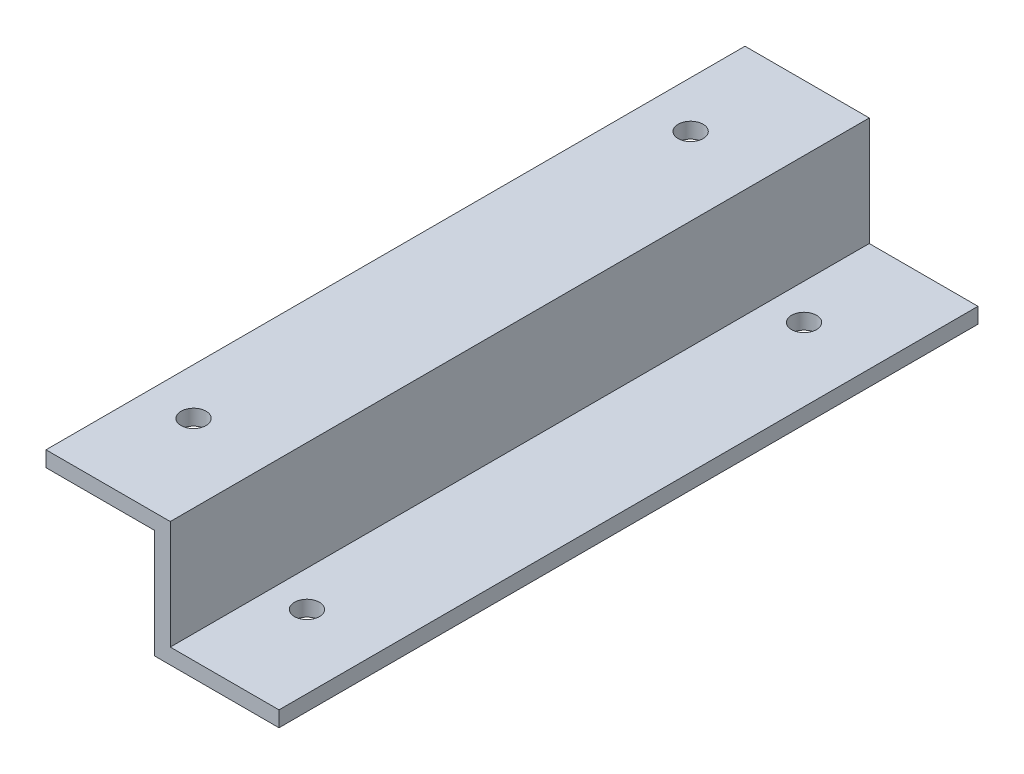
ISO-10303-21;
HEADER;
FILE_DESCRIPTION(('STEP AP214'),'2;1');
FILE_NAME('part.step','',(''),(''),'','','');
FILE_SCHEMA(('AUTOMOTIVE_DESIGN { 1 0 10303 214 1 1 1 1 }'));
ENDSEC;
DATA;
#1=APPLICATION_CONTEXT('core data for automotive mechanical design processes');
#2=APPLICATION_PROTOCOL_DEFINITION('international standard','automotive_design',2000,#1);
#3=PRODUCT_CONTEXT('',#1,'mechanical');
#4=PRODUCT('Part','Part','',(#3));
#5=PRODUCT_RELATED_PRODUCT_CATEGORY('part','',(#4));
#6=PRODUCT_DEFINITION_FORMATION('','',#4);
#7=PRODUCT_DEFINITION_CONTEXT('part definition',#1,'design');
#8=PRODUCT_DEFINITION('design','',#6,#7);
#9=PRODUCT_DEFINITION_SHAPE('','',#8);
#10=(LENGTH_UNIT() NAMED_UNIT(*) SI_UNIT(.MILLI.,.METRE.));
#11=(NAMED_UNIT(*) PLANE_ANGLE_UNIT() SI_UNIT($,.RADIAN.));
#12=(NAMED_UNIT(*) SI_UNIT($,.STERADIAN.) SOLID_ANGLE_UNIT());
#13=UNCERTAINTY_MEASURE_WITH_UNIT(LENGTH_MEASURE(1.E-05),#10,'distance_accuracy_value','');
#14=(GEOMETRIC_REPRESENTATION_CONTEXT(3) GLOBAL_UNCERTAINTY_ASSIGNED_CONTEXT((#13)) GLOBAL_UNIT_ASSIGNED_CONTEXT((#10,
#11,#12)) REPRESENTATION_CONTEXT('',''));
#15=CARTESIAN_POINT('',(0.,0.,0.));
#16=DIRECTION('',(0.,0.,1.));
#17=DIRECTION('',(1.,0.,0.));
#18=AXIS2_PLACEMENT_3D('',#15,#16,#17);
#19=CARTESIAN_POINT('',(1.5875,-9.525,71.4375));
#20=DIRECTION('',(0.,-1.,0.));
#21=DIRECTION('',(0.,0.,-1.));
#22=AXIS2_PLACEMENT_3D('',#19,#20,#21);
#23=PLANE('',#22);
#24=CARTESIAN_POINT('',(8.89000000000002,-9.525,50.799999492));
#25=DIRECTION('',(0.,1.,0.));
#26=DIRECTION('',(0.,0.,1.));
#27=AXIS2_PLACEMENT_3D('',#24,#25,#26);
#28=CIRCLE('',#27,2.55269999999999);
#29=CARTESIAN_POINT('',(8.89000000000002,-9.525,53.352699492));
#30=VERTEX_POINT('',#29);
#31=EDGE_CURVE('E213',#30,#30,#28,.T.);
#32=ORIENTED_EDGE('',*,*,#31,.F.);
#33=EDGE_LOOP('',(#32));
#34=FACE_BOUND('',#33,.T.);
#35=CARTESIAN_POINT('',(8.89000000000002,-9.525,-50.7997000062309));
#36=DIRECTION('',(0.,1.,0.));
#37=DIRECTION('',(0.,0.,1.));
#38=AXIS2_PLACEMENT_3D('',#35,#36,#37);
#39=CIRCLE('',#38,2.55269999999999);
#40=CARTESIAN_POINT('',(8.89000000000002,-9.525,-48.2470000062309));
#41=VERTEX_POINT('',#40);
#42=EDGE_CURVE('E216',#41,#41,#39,.T.);
#43=ORIENTED_EDGE('',*,*,#42,.F.);
#44=EDGE_LOOP('',(#43));
#45=FACE_BOUND('',#44,.T.);
#46=DIRECTION('',(0.,0.,-1.));
#47=VECTOR('',#46,1.);
#48=CARTESIAN_POINT('',(23.8125,-9.525,71.4375));
#49=LINE('',#48,#47);
#50=CARTESIAN_POINT('',(23.8125,-9.525,71.4375));
#51=VERTEX_POINT('',#50);
#52=CARTESIAN_POINT('',(23.8125,-9.525,-71.4375));
#53=VERTEX_POINT('',#52);
#54=EDGE_CURVE('E123',#51,#53,#49,.T.);
#55=ORIENTED_EDGE('',*,*,#54,.T.);
#56=DIRECTION('',(-1.,0.,0.));
#57=VECTOR('',#56,1.);
#58=CARTESIAN_POINT('',(1.5875,-9.525,-71.4375));
#59=LINE('',#58,#57);
#60=CARTESIAN_POINT('',(1.5875,-9.525,-71.4375));
#61=VERTEX_POINT('',#60);
#62=EDGE_CURVE('E117',#53,#61,#59,.T.);
#63=ORIENTED_EDGE('',*,*,#62,.T.);
#64=DIRECTION('',(0.,0.,-1.));
#65=VECTOR('',#64,1.);
#66=CARTESIAN_POINT('',(1.5875,-9.525,71.4375));
#67=LINE('',#66,#65);
#68=CARTESIAN_POINT('',(1.5875,-9.525,71.4375));
#69=VERTEX_POINT('',#68);
#70=EDGE_CURVE('E11',#69,#61,#67,.T.);
#71=ORIENTED_EDGE('',*,*,#70,.F.);
#72=DIRECTION('',(-1.,0.,0.));
#73=VECTOR('',#72,1.);
#74=CARTESIAN_POINT('',(1.5875,-9.525,71.4375));
#75=LINE('',#74,#73);
#76=EDGE_CURVE('E146',#51,#69,#75,.T.);
#77=ORIENTED_EDGE('',*,*,#76,.F.);
#78=EDGE_LOOP('',(#55,#63,#71,#77));
#79=FACE_BOUND('',#78,.T.);
#80=ADVANCED_FACE('F39',(#34,#45,#79),#23,.F.);
#81=CARTESIAN_POINT('',(1.5875,-9.525,71.4375));
#82=DIRECTION('',(-1.,0.,0.));
#83=DIRECTION('',(0.,0.,1.));
#84=AXIS2_PLACEMENT_3D('',#81,#82,#83);
#85=PLANE('',#84);
#86=ORIENTED_EDGE('',*,*,#70,.T.);
#87=DIRECTION('',(0.,1.,0.));
#88=VECTOR('',#87,1.);
#89=CARTESIAN_POINT('',(1.5875,-9.525,-71.4375));
#90=LINE('',#89,#88);
#91=CARTESIAN_POINT('',(1.5875,12.7,-71.4375));
#92=VERTEX_POINT('',#91);
#93=EDGE_CURVE('E107',#61,#92,#90,.T.);
#94=ORIENTED_EDGE('',*,*,#93,.T.);
#95=DIRECTION('',(0.,0.,-1.));
#96=VECTOR('',#95,1.);
#97=CARTESIAN_POINT('',(1.5875,12.7,71.4375));
#98=LINE('',#97,#96);
#99=CARTESIAN_POINT('',(1.5875,12.7,71.4375));
#100=VERTEX_POINT('',#99);
#101=EDGE_CURVE('E47',#100,#92,#98,.T.);
#102=ORIENTED_EDGE('',*,*,#101,.F.);
#103=DIRECTION('',(0.,1.,0.));
#104=VECTOR('',#103,1.);
#105=CARTESIAN_POINT('',(1.5875,-9.525,71.4375));
#106=LINE('',#105,#104);
#107=EDGE_CURVE('E108',#69,#100,#106,.T.);
#108=ORIENTED_EDGE('',*,*,#107,.F.);
#109=EDGE_LOOP('',(#86,#94,#102,#108));
#110=FACE_BOUND('',#109,.T.);
#111=ADVANCED_FACE('F105',(#110),#85,.F.);
#112=CARTESIAN_POINT('',(1.5875,12.7,71.4375));
#113=DIRECTION('',(0.,-1.,0.));
#114=DIRECTION('',(0.,0.,-1.));
#115=AXIS2_PLACEMENT_3D('',#112,#113,#114);
#116=PLANE('',#115);
#117=CARTESIAN_POINT('',(-14.2874999999999,12.7,50.799999492));
#118=DIRECTION('',(0.,1.,0.));
#119=DIRECTION('',(0.,0.,1.));
#120=AXIS2_PLACEMENT_3D('',#117,#118,#119);
#121=CIRCLE('',#120,2.55269999999999);
#122=CARTESIAN_POINT('',(-14.2874999999999,12.7,53.352699492));
#123=VERTEX_POINT('',#122);
#124=EDGE_CURVE('E222',#123,#123,#121,.T.);
#125=ORIENTED_EDGE('',*,*,#124,.F.);
#126=EDGE_LOOP('',(#125));
#127=FACE_BOUND('',#126,.T.);
#128=CARTESIAN_POINT('',(-14.2874999999999,12.7,-50.8000005079999));
#129=DIRECTION('',(0.,1.,0.));
#130=DIRECTION('',(0.,0.,1.));
#131=AXIS2_PLACEMENT_3D('',#128,#129,#130);
#132=CIRCLE('',#131,2.55269999999999);
#133=CARTESIAN_POINT('',(-14.2874999999999,12.7,-48.247300508));
#134=VERTEX_POINT('',#133);
#135=EDGE_CURVE('E127',#134,#134,#132,.T.);
#136=ORIENTED_EDGE('',*,*,#135,.F.);
#137=EDGE_LOOP('',(#136));
#138=FACE_BOUND('',#137,.T.);
#139=ORIENTED_EDGE('',*,*,#101,.T.);
#140=DIRECTION('',(-1.,0.,0.));
#141=VECTOR('',#140,1.);
#142=CARTESIAN_POINT('',(1.5875,12.7,-71.4375));
#143=LINE('',#142,#141);
#144=CARTESIAN_POINT('',(-23.8125,12.7,-71.4375));
#145=VERTEX_POINT('',#144);
#146=EDGE_CURVE('E121',#92,#145,#143,.T.);
#147=ORIENTED_EDGE('',*,*,#146,.T.);
#148=DIRECTION('',(0.,0.,-1.));
#149=VECTOR('',#148,1.);
#150=CARTESIAN_POINT('',(-23.8125,12.7,71.4375));
#151=LINE('',#150,#149);
#152=CARTESIAN_POINT('',(-23.8125,12.7,71.4375));
#153=VERTEX_POINT('',#152);
#154=EDGE_CURVE('E168',#153,#145,#151,.T.);
#155=ORIENTED_EDGE('',*,*,#154,.F.);
#156=DIRECTION('',(-1.,0.,0.));
#157=VECTOR('',#156,1.);
#158=CARTESIAN_POINT('',(1.5875,12.7,71.4375));
#159=LINE('',#158,#157);
#160=EDGE_CURVE('E149',#100,#153,#159,.T.);
#161=ORIENTED_EDGE('',*,*,#160,.F.);
#162=EDGE_LOOP('',(#139,#147,#155,#161));
#163=FACE_BOUND('',#162,.T.);
#164=ADVANCED_FACE('F172',(#127,#138,#163),#116,.F.);
#165=CARTESIAN_POINT('',(-23.8125,12.7,71.4375));
#166=DIRECTION('',(1.,0.,0.));
#167=DIRECTION('',(0.,0.,-1.));
#168=AXIS2_PLACEMENT_3D('',#165,#166,#167);
#169=PLANE('',#168);
#170=ORIENTED_EDGE('',*,*,#154,.T.);
#171=DIRECTION('',(0.,-1.,0.));
#172=VECTOR('',#171,1.);
#173=CARTESIAN_POINT('',(-23.8125,12.7,-71.4375));
#174=LINE('',#173,#172);
#175=CARTESIAN_POINT('',(-23.8125,9.525,-71.4375));
#176=VERTEX_POINT('',#175);
#177=EDGE_CURVE('E132',#145,#176,#174,.T.);
#178=ORIENTED_EDGE('',*,*,#177,.T.);
#179=DIRECTION('',(0.,0.,-1.));
#180=VECTOR('',#179,1.);
#181=CARTESIAN_POINT('',(-23.8125,9.525,71.4375));
#182=LINE('',#181,#180);
#183=CARTESIAN_POINT('',(-23.8125,9.525,71.4375));
#184=VERTEX_POINT('',#183);
#185=EDGE_CURVE('E166',#184,#176,#182,.T.);
#186=ORIENTED_EDGE('',*,*,#185,.F.);
#187=DIRECTION('',(0.,-1.,0.));
#188=VECTOR('',#187,1.);
#189=CARTESIAN_POINT('',(-23.8125,12.7,71.4375));
#190=LINE('',#189,#188);
#191=EDGE_CURVE('E151',#153,#184,#190,.T.);
#192=ORIENTED_EDGE('',*,*,#191,.F.);
#193=EDGE_LOOP('',(#170,#178,#186,#192));
#194=FACE_BOUND('',#193,.T.);
#195=ADVANCED_FACE('F180',(#194),#169,.F.);
#196=CARTESIAN_POINT('',(-1.5875,9.525,71.4375));
#197=DIRECTION('',(0.,1.,0.));
#198=DIRECTION('',(0.,0.,1.));
#199=AXIS2_PLACEMENT_3D('',#196,#197,#198);
#200=PLANE('',#199);
#201=CARTESIAN_POINT('',(-14.2874999999999,9.525,50.799999492));
#202=DIRECTION('',(0.,1.,0.));
#203=DIRECTION('',(0.,0.,1.));
#204=AXIS2_PLACEMENT_3D('',#201,#202,#203);
#205=CIRCLE('',#204,2.55269999999999);
#206=CARTESIAN_POINT('',(-14.2874999999999,9.525,53.352699492));
#207=VERTEX_POINT('',#206);
#208=EDGE_CURVE('E42',#207,#207,#205,.T.);
#209=ORIENTED_EDGE('',*,*,#208,.T.);
#210=EDGE_LOOP('',(#209));
#211=FACE_BOUND('',#210,.T.);
#212=CARTESIAN_POINT('',(-14.2874999999999,9.525,-50.8000005079999));
#213=DIRECTION('',(0.,1.,0.));
#214=DIRECTION('',(0.,0.,1.));
#215=AXIS2_PLACEMENT_3D('',#212,#213,#214);
#216=CIRCLE('',#215,2.55269999999999);
#217=CARTESIAN_POINT('',(-14.2874999999999,9.525,-48.247300508));
#218=VERTEX_POINT('',#217);
#219=EDGE_CURVE('E124',#218,#218,#216,.T.);
#220=ORIENTED_EDGE('',*,*,#219,.T.);
#221=EDGE_LOOP('',(#220));
#222=FACE_BOUND('',#221,.T.);
#223=ORIENTED_EDGE('',*,*,#185,.T.);
#224=DIRECTION('',(1.,0.,0.));
#225=VECTOR('',#224,1.);
#226=CARTESIAN_POINT('',(-1.5875,9.525,-71.4375));
#227=LINE('',#226,#225);
#228=CARTESIAN_POINT('',(-1.5875,9.525,-71.4375));
#229=VERTEX_POINT('',#228);
#230=EDGE_CURVE('E135',#176,#229,#227,.T.);
#231=ORIENTED_EDGE('',*,*,#230,.T.);
#232=DIRECTION('',(0.,0.,-1.));
#233=VECTOR('',#232,1.);
#234=CARTESIAN_POINT('',(-1.5875,9.525,71.4375));
#235=LINE('',#234,#233);
#236=CARTESIAN_POINT('',(-1.5875,9.525,71.4375));
#237=VERTEX_POINT('',#236);
#238=EDGE_CURVE('E164',#237,#229,#235,.T.);
#239=ORIENTED_EDGE('',*,*,#238,.F.);
#240=DIRECTION('',(1.,0.,0.));
#241=VECTOR('',#240,1.);
#242=CARTESIAN_POINT('',(-1.5875,9.525,71.4375));
#243=LINE('',#242,#241);
#244=EDGE_CURVE('E153',#184,#237,#243,.T.);
#245=ORIENTED_EDGE('',*,*,#244,.F.);
#246=EDGE_LOOP('',(#223,#231,#239,#245));
#247=FACE_BOUND('',#246,.T.);
#248=ADVANCED_FACE('F183',(#211,#222,#247),#200,.F.);
#249=CARTESIAN_POINT('',(-1.5875,-12.7,71.4375));
#250=DIRECTION('',(1.,0.,0.));
#251=DIRECTION('',(0.,0.,-1.));
#252=AXIS2_PLACEMENT_3D('',#249,#250,#251);
#253=PLANE('',#252);
#254=ORIENTED_EDGE('',*,*,#238,.T.);
#255=DIRECTION('',(0.,-1.,0.));
#256=VECTOR('',#255,1.);
#257=CARTESIAN_POINT('',(-1.5875,-12.7,-71.4375));
#258=LINE('',#257,#256);
#259=CARTESIAN_POINT('',(-1.5875,-12.7,-71.4375));
#260=VERTEX_POINT('',#259);
#261=EDGE_CURVE('E138',#229,#260,#258,.T.);
#262=ORIENTED_EDGE('',*,*,#261,.T.);
#263=DIRECTION('',(0.,0.,-1.));
#264=VECTOR('',#263,1.);
#265=CARTESIAN_POINT('',(-1.5875,-12.7,71.4375));
#266=LINE('',#265,#264);
#267=CARTESIAN_POINT('',(-1.5875,-12.7,71.4375));
#268=VERTEX_POINT('',#267);
#269=EDGE_CURVE('E162',#268,#260,#266,.T.);
#270=ORIENTED_EDGE('',*,*,#269,.F.);
#271=DIRECTION('',(0.,-1.,0.));
#272=VECTOR('',#271,1.);
#273=CARTESIAN_POINT('',(-1.5875,-12.7,71.4375));
#274=LINE('',#273,#272);
#275=EDGE_CURVE('E155',#237,#268,#274,.T.);
#276=ORIENTED_EDGE('',*,*,#275,.F.);
#277=EDGE_LOOP('',(#254,#262,#270,#276));
#278=FACE_BOUND('',#277,.T.);
#279=ADVANCED_FACE('F188',(#278),#253,.F.);
#280=CARTESIAN_POINT('',(-1.5875,-12.7,71.4375));
#281=DIRECTION('',(0.,1.,0.));
#282=DIRECTION('',(0.,0.,1.));
#283=AXIS2_PLACEMENT_3D('',#280,#281,#282);
#284=PLANE('',#283);
#285=CARTESIAN_POINT('',(8.89000000000002,-12.7,50.799999492));
#286=DIRECTION('',(0.,1.,0.));
#287=DIRECTION('',(0.,0.,1.));
#288=AXIS2_PLACEMENT_3D('',#285,#286,#287);
#289=CIRCLE('',#288,2.5527);
#290=CARTESIAN_POINT('',(8.89000000000002,-12.7,53.352699492));
#291=VERTEX_POINT('',#290);
#292=EDGE_CURVE('E219',#291,#291,#289,.T.);
#293=ORIENTED_EDGE('',*,*,#292,.T.);
#294=EDGE_LOOP('',(#293));
#295=FACE_BOUND('',#294,.T.);
#296=CARTESIAN_POINT('',(8.89000000000002,-12.7,-50.7997000062309));
#297=DIRECTION('',(0.,1.,0.));
#298=DIRECTION('',(0.,0.,1.));
#299=AXIS2_PLACEMENT_3D('',#296,#297,#298);
#300=CIRCLE('',#299,2.5527);
#301=CARTESIAN_POINT('',(8.89000000000002,-12.7,-48.2470000062309));
#302=VERTEX_POINT('',#301);
#303=EDGE_CURVE('E218',#302,#302,#300,.T.);
#304=ORIENTED_EDGE('',*,*,#303,.T.);
#305=EDGE_LOOP('',(#304));
#306=FACE_BOUND('',#305,.T.);
#307=ORIENTED_EDGE('',*,*,#269,.T.);
#308=DIRECTION('',(1.,0.,0.));
#309=VECTOR('',#308,1.);
#310=CARTESIAN_POINT('',(-1.5875,-12.7,-71.4375));
#311=LINE('',#310,#309);
#312=CARTESIAN_POINT('',(23.8125,-12.7,-71.4375));
#313=VERTEX_POINT('',#312);
#314=EDGE_CURVE('E141',#260,#313,#311,.T.);
#315=ORIENTED_EDGE('',*,*,#314,.T.);
#316=DIRECTION('',(0.,0.,-1.));
#317=VECTOR('',#316,1.);
#318=CARTESIAN_POINT('',(23.8125,-12.7,71.4375));
#319=LINE('',#318,#317);
#320=CARTESIAN_POINT('',(23.8125,-12.7,71.4375));
#321=VERTEX_POINT('',#320);
#322=EDGE_CURVE('E160',#321,#313,#319,.T.);
#323=ORIENTED_EDGE('',*,*,#322,.F.);
#324=DIRECTION('',(1.,0.,0.));
#325=VECTOR('',#324,1.);
#326=CARTESIAN_POINT('',(-1.5875,-12.7,71.4375));
#327=LINE('',#326,#325);
#328=EDGE_CURVE('E60',#268,#321,#327,.T.);
#329=ORIENTED_EDGE('',*,*,#328,.F.);
#330=EDGE_LOOP('',(#307,#315,#323,#329));
#331=FACE_BOUND('',#330,.T.);
#332=ADVANCED_FACE('F191',(#295,#306,#331),#284,.F.);
#333=CARTESIAN_POINT('',(23.8125,-9.525,71.4375));
#334=DIRECTION('',(-1.,0.,0.));
#335=DIRECTION('',(0.,0.,1.));
#336=AXIS2_PLACEMENT_3D('',#333,#334,#335);
#337=PLANE('',#336);
#338=ORIENTED_EDGE('',*,*,#322,.T.);
#339=DIRECTION('',(0.,1.,0.));
#340=VECTOR('',#339,1.);
#341=CARTESIAN_POINT('',(23.8125,-9.525,-71.4375));
#342=LINE('',#341,#340);
#343=EDGE_CURVE('E144',#313,#53,#342,.T.);
#344=ORIENTED_EDGE('',*,*,#343,.T.);
#345=ORIENTED_EDGE('',*,*,#54,.F.);
#346=DIRECTION('',(0.,1.,0.));
#347=VECTOR('',#346,1.);
#348=CARTESIAN_POINT('',(23.8125,-9.525,71.4375));
#349=LINE('',#348,#347);
#350=EDGE_CURVE('E55',#321,#51,#349,.T.);
#351=ORIENTED_EDGE('',*,*,#350,.F.);
#352=EDGE_LOOP('',(#338,#344,#345,#351));
#353=FACE_BOUND('',#352,.T.);
#354=ADVANCED_FACE('F193',(#353),#337,.F.);
#355=CARTESIAN_POINT('',(0.,0.,71.4375));
#356=DIRECTION('',(0.,0.,-1.));
#357=DIRECTION('',(-1.,0.,0.));
#358=AXIS2_PLACEMENT_3D('',#355,#356,#357);
#359=PLANE('',#358);
#360=ORIENTED_EDGE('',*,*,#76,.T.);
#361=ORIENTED_EDGE('',*,*,#107,.T.);
#362=ORIENTED_EDGE('',*,*,#160,.T.);
#363=ORIENTED_EDGE('',*,*,#191,.T.);
#364=ORIENTED_EDGE('',*,*,#244,.T.);
#365=ORIENTED_EDGE('',*,*,#275,.T.);
#366=ORIENTED_EDGE('',*,*,#328,.T.);
#367=ORIENTED_EDGE('',*,*,#350,.T.);
#368=EDGE_LOOP('',(#360,#361,#362,#363,#364,#365,#366,#367));
#369=FACE_BOUND('',#368,.T.);
#370=ADVANCED_FACE('F175',(#369),#359,.F.);
#371=CARTESIAN_POINT('',(0.,0.,-71.4375));
#372=DIRECTION('',(0.,0.,-1.));
#373=DIRECTION('',(-1.,0.,0.));
#374=AXIS2_PLACEMENT_3D('',#371,#372,#373);
#375=PLANE('',#374);
#376=ORIENTED_EDGE('',*,*,#62,.F.);
#377=ORIENTED_EDGE('',*,*,#343,.F.);
#378=ORIENTED_EDGE('',*,*,#314,.F.);
#379=ORIENTED_EDGE('',*,*,#261,.F.);
#380=ORIENTED_EDGE('',*,*,#230,.F.);
#381=ORIENTED_EDGE('',*,*,#177,.F.);
#382=ORIENTED_EDGE('',*,*,#146,.F.);
#383=ORIENTED_EDGE('',*,*,#93,.F.);
#384=EDGE_LOOP('',(#376,#377,#378,#379,#380,#381,#382,#383));
#385=FACE_BOUND('',#384,.T.);
#386=ADVANCED_FACE('F115',(#385),#375,.T.);
#387=CARTESIAN_POINT('',(-14.2874999999999,12.7,-50.8000005079999));
#388=DIRECTION('',(0.,1.,0.));
#389=DIRECTION('',(0.,0.,1.));
#390=AXIS2_PLACEMENT_3D('',#387,#388,#389);
#391=CYLINDRICAL_SURFACE('',#390,2.55269999999999);
#392=ORIENTED_EDGE('',*,*,#135,.T.);
#393=EDGE_LOOP('',(#392));
#394=FACE_BOUND('',#393,.T.);
#395=ORIENTED_EDGE('',*,*,#219,.F.);
#396=EDGE_LOOP('',(#395));
#397=FACE_BOUND('',#396,.T.);
#398=ADVANCED_FACE('F236',(#394,#397),#391,.F.);
#399=CARTESIAN_POINT('',(-14.2874999999999,12.7,50.799999492));
#400=DIRECTION('',(0.,1.,0.));
#401=DIRECTION('',(0.,0.,1.));
#402=AXIS2_PLACEMENT_3D('',#399,#400,#401);
#403=CYLINDRICAL_SURFACE('',#402,2.55269999999999);
#404=ORIENTED_EDGE('',*,*,#124,.T.);
#405=EDGE_LOOP('',(#404));
#406=FACE_BOUND('',#405,.T.);
#407=ORIENTED_EDGE('',*,*,#208,.F.);
#408=EDGE_LOOP('',(#407));
#409=FACE_BOUND('',#408,.T.);
#410=ADVANCED_FACE('F273',(#406,#409),#403,.F.);
#411=CARTESIAN_POINT('',(8.89000000000002,-9.525,-50.7997000062309));
#412=DIRECTION('',(0.,1.,0.));
#413=DIRECTION('',(0.,0.,1.));
#414=AXIS2_PLACEMENT_3D('',#411,#412,#413);
#415=CYLINDRICAL_SURFACE('',#414,2.55269999999999);
#416=ORIENTED_EDGE('',*,*,#303,.F.);
#417=EDGE_LOOP('',(#416));
#418=FACE_BOUND('',#417,.T.);
#419=ORIENTED_EDGE('',*,*,#42,.T.);
#420=EDGE_LOOP('',(#419));
#421=FACE_BOUND('',#420,.T.);
#422=ADVANCED_FACE('F267',(#418,#421),#415,.F.);
#423=CARTESIAN_POINT('',(8.89000000000002,-9.525,50.799999492));
#424=DIRECTION('',(0.,1.,0.));
#425=DIRECTION('',(0.,0.,1.));
#426=AXIS2_PLACEMENT_3D('',#423,#424,#425);
#427=CYLINDRICAL_SURFACE('',#426,2.55269999999999);
#428=ORIENTED_EDGE('',*,*,#292,.F.);
#429=EDGE_LOOP('',(#428));
#430=FACE_BOUND('',#429,.T.);
#431=ORIENTED_EDGE('',*,*,#31,.T.);
#432=EDGE_LOOP('',(#431));
#433=FACE_BOUND('',#432,.T.);
#434=ADVANCED_FACE('F272',(#430,#433),#427,.F.);
#435=CLOSED_SHELL('',(#80,#111,#164,#195,#248,#279,#332,#354,#370,#386,#398,#410,#422,#434));
#436=MANIFOLD_SOLID_BREP('B2',#435);
#437=ADVANCED_BREP_SHAPE_REPRESENTATION('',(#18,#436),#14);
#438=SHAPE_DEFINITION_REPRESENTATION(#9,#437);
ENDSEC;
END-ISO-10303-21;
